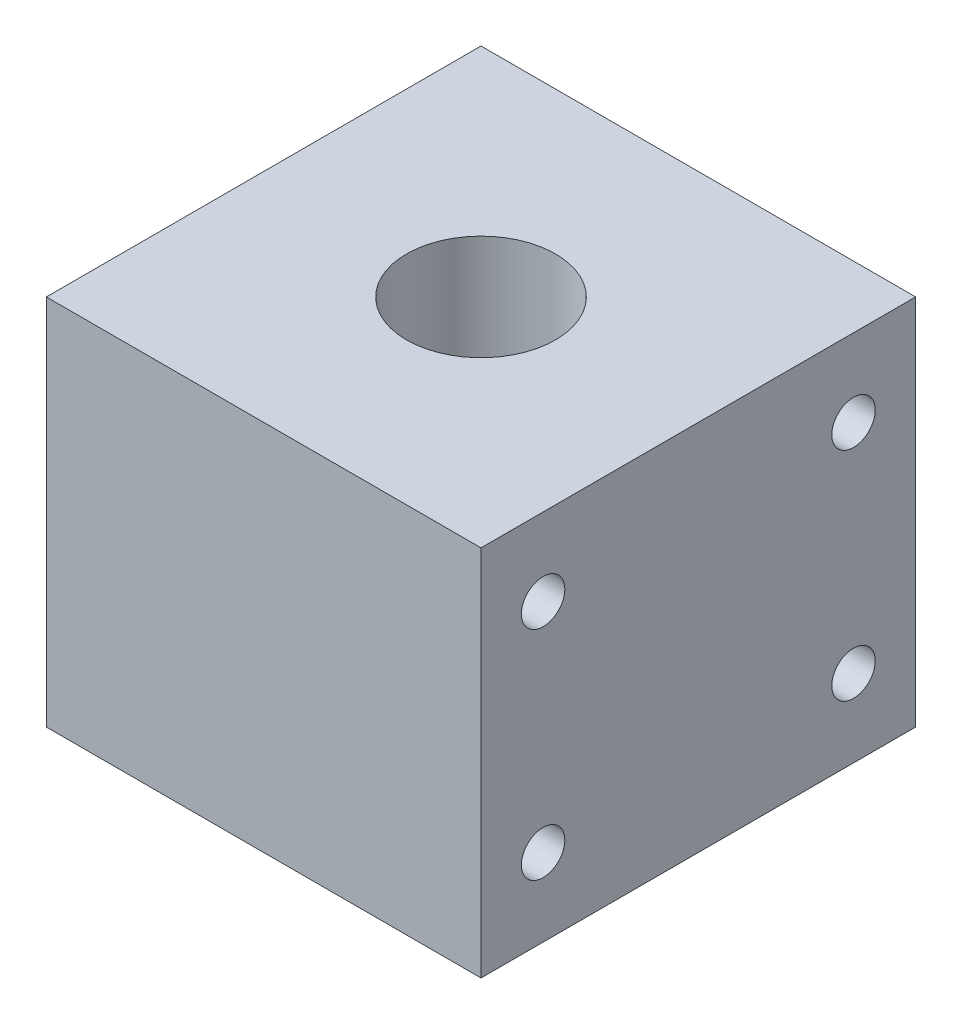
ISO-10303-21;
HEADER;
FILE_DESCRIPTION(('STEP AP214'),'2;1');
FILE_NAME('part.step','',(''),(''),'','','');
FILE_SCHEMA(('AUTOMOTIVE_DESIGN { 1 0 10303 214 1 1 1 1 }'));
ENDSEC;
DATA;
#1=APPLICATION_CONTEXT('core data for automotive mechanical design processes');
#2=APPLICATION_PROTOCOL_DEFINITION('international standard','automotive_design',2000,#1);
#3=PRODUCT_CONTEXT('',#1,'mechanical');
#4=PRODUCT('Part','Part','',(#3));
#5=PRODUCT_RELATED_PRODUCT_CATEGORY('part','',(#4));
#6=PRODUCT_DEFINITION_FORMATION('','',#4);
#7=PRODUCT_DEFINITION_CONTEXT('part definition',#1,'design');
#8=PRODUCT_DEFINITION('design','',#6,#7);
#9=PRODUCT_DEFINITION_SHAPE('','',#8);
#10=(LENGTH_UNIT() NAMED_UNIT(*) SI_UNIT(.MILLI.,.METRE.));
#11=(NAMED_UNIT(*) PLANE_ANGLE_UNIT() SI_UNIT($,.RADIAN.));
#12=(NAMED_UNIT(*) SI_UNIT($,.STERADIAN.) SOLID_ANGLE_UNIT());
#13=UNCERTAINTY_MEASURE_WITH_UNIT(LENGTH_MEASURE(1.E-05),#10,'distance_accuracy_value','');
#14=(GEOMETRIC_REPRESENTATION_CONTEXT(3) GLOBAL_UNCERTAINTY_ASSIGNED_CONTEXT((#13)) GLOBAL_UNIT_ASSIGNED_CONTEXT((#10,
#11,#12)) REPRESENTATION_CONTEXT('',''));
#15=CARTESIAN_POINT('',(0.,0.,0.));
#16=DIRECTION('',(0.,0.,1.));
#17=DIRECTION('',(1.,0.,0.));
#18=AXIS2_PLACEMENT_3D('',#15,#16,#17);
#19=CARTESIAN_POINT('',(0.,23.,0.));
#20=DIRECTION('',(0.,1.,0.));
#21=DIRECTION('',(0.,0.,1.));
#22=AXIS2_PLACEMENT_3D('',#19,#20,#21);
#23=PLANE('',#22);
#24=CARTESIAN_POINT('',(35.,23.,-35.));
#25=DIRECTION('',(0.,1.,0.));
#26=DIRECTION('',(0.,0.,1.));
#27=AXIS2_PLACEMENT_3D('',#24,#25,#26);
#28=CIRCLE('',#27,23.5);
#29=CARTESIAN_POINT('',(35.,23.,-11.5));
#30=VERTEX_POINT('',#29);
#31=EDGE_CURVE('E218',#30,#30,#28,.T.);
#32=ORIENTED_EDGE('',*,*,#31,.F.);
#33=EDGE_LOOP('',(#32));
#34=FACE_BOUND('',#33,.T.);
#35=CARTESIAN_POINT('',(35.,23.,-35.));
#36=DIRECTION('',(0.,1.,0.));
#37=DIRECTION('',(0.,0.,1.));
#38=AXIS2_PLACEMENT_3D('',#35,#36,#37);
#39=CIRCLE('',#38,16.);
#40=CARTESIAN_POINT('',(35.,23.,-19.));
#41=VERTEX_POINT('',#40);
#42=EDGE_CURVE('E217',#41,#41,#39,.F.);
#43=ORIENTED_EDGE('',*,*,#42,.F.);
#44=EDGE_LOOP('',(#43));
#45=FACE_BOUND('',#44,.T.);
#46=ADVANCED_FACE('F37',(#34,#45),#23,.F.);
#47=CARTESIAN_POINT('',(0.,0.,0.));
#48=DIRECTION('',(0.,1.,0.));
#49=DIRECTION('',(0.,0.,1.));
#50=AXIS2_PLACEMENT_3D('',#47,#48,#49);
#51=PLANE('',#50);
#52=DIRECTION('',(1.,0.,0.));
#53=VECTOR('',#52,1.);
#54=CARTESIAN_POINT('',(0.,0.,-65.));
#55=LINE('',#54,#53);
#56=CARTESIAN_POINT('',(15.0000000000001,0.,-65.));
#57=VERTEX_POINT('',#56);
#58=CARTESIAN_POINT('',(54.9999999999999,0.,-65.));
#59=VERTEX_POINT('',#58);
#60=EDGE_CURVE('E225',#57,#59,#55,.T.);
#61=ORIENTED_EDGE('',*,*,#60,.F.);
#62=CARTESIAN_POINT('',(15.,0.,-55.));
#63=DIRECTION('',(0.,1.,0.));
#64=DIRECTION('',(0.,0.,1.));
#65=AXIS2_PLACEMENT_3D('',#62,#63,#64);
#66=CIRCLE('',#65,10.);
#67=CARTESIAN_POINT('',(5.,0.,-54.9999999999999));
#68=VERTEX_POINT('',#67);
#69=EDGE_CURVE('E52',#68,#57,#66,.F.);
#70=ORIENTED_EDGE('',*,*,#69,.F.);
#71=DIRECTION('',(0.,0.,-1.));
#72=VECTOR('',#71,1.);
#73=CARTESIAN_POINT('',(5.00000000000001,0.,0.));
#74=LINE('',#73,#72);
#75=CARTESIAN_POINT('',(5.,0.,-15.0000000000001));
#76=VERTEX_POINT('',#75);
#77=EDGE_CURVE('E248',#76,#68,#74,.T.);
#78=ORIENTED_EDGE('',*,*,#77,.F.);
#79=CARTESIAN_POINT('',(15.,0.,-15.));
#80=DIRECTION('',(0.,1.,0.));
#81=DIRECTION('',(0.,0.,1.));
#82=AXIS2_PLACEMENT_3D('',#79,#80,#81);
#83=CIRCLE('',#82,10.);
#84=CARTESIAN_POINT('',(15.0000000000001,0.,-4.99999999999999));
#85=VERTEX_POINT('',#84);
#86=EDGE_CURVE('E251',#85,#76,#83,.F.);
#87=ORIENTED_EDGE('',*,*,#86,.F.);
#88=DIRECTION('',(-1.,0.,0.));
#89=VECTOR('',#88,1.);
#90=CARTESIAN_POINT('',(0.,0.,-4.99999999999999));
#91=LINE('',#90,#89);
#92=CARTESIAN_POINT('',(54.9999999999999,0.,-4.99999999999999));
#93=VERTEX_POINT('',#92);
#94=EDGE_CURVE('E254',#93,#85,#91,.T.);
#95=ORIENTED_EDGE('',*,*,#94,.F.);
#96=CARTESIAN_POINT('',(55.,0.,-15.));
#97=DIRECTION('',(0.,1.,0.));
#98=DIRECTION('',(0.,0.,1.));
#99=AXIS2_PLACEMENT_3D('',#96,#97,#98);
#100=CIRCLE('',#99,10.);
#101=CARTESIAN_POINT('',(65.,0.,-15.0000000000001));
#102=VERTEX_POINT('',#101);
#103=EDGE_CURVE('E257',#102,#93,#100,.F.);
#104=ORIENTED_EDGE('',*,*,#103,.F.);
#105=DIRECTION('',(0.,0.,1.));
#106=VECTOR('',#105,1.);
#107=CARTESIAN_POINT('',(65.,0.,0.));
#108=LINE('',#107,#106);
#109=CARTESIAN_POINT('',(65.,0.,-54.9999999999999));
#110=VERTEX_POINT('',#109);
#111=EDGE_CURVE('E260',#110,#102,#108,.T.);
#112=ORIENTED_EDGE('',*,*,#111,.F.);
#113=CARTESIAN_POINT('',(55.,0.,-55.));
#114=DIRECTION('',(0.,1.,0.));
#115=DIRECTION('',(0.,0.,1.));
#116=AXIS2_PLACEMENT_3D('',#113,#114,#115);
#117=CIRCLE('',#116,10.);
#118=EDGE_CURVE('E263',#59,#110,#117,.F.);
#119=ORIENTED_EDGE('',*,*,#118,.F.);
#120=EDGE_LOOP('',(#61,#70,#78,#87,#95,#104,#112,#119));
#121=FACE_BOUND('',#120,.T.);
#122=DIRECTION('',(1.,0.,0.));
#123=VECTOR('',#122,1.);
#124=CARTESIAN_POINT('',(0.,0.,0.));
#125=LINE('',#124,#123);
#126=CARTESIAN_POINT('',(0.,0.,0.));
#127=VERTEX_POINT('',#126);
#128=CARTESIAN_POINT('',(70.,0.,0.));
#129=VERTEX_POINT('',#128);
#130=EDGE_CURVE('E283',#127,#129,#125,.T.);
#131=ORIENTED_EDGE('',*,*,#130,.F.);
#132=DIRECTION('',(0.,0.,-1.));
#133=VECTOR('',#132,1.);
#134=CARTESIAN_POINT('',(0.,0.,0.));
#135=LINE('',#134,#133);
#136=CARTESIAN_POINT('',(0.,0.,-70.));
#137=VERTEX_POINT('',#136);
#138=EDGE_CURVE('E286',#127,#137,#135,.T.);
#139=ORIENTED_EDGE('',*,*,#138,.T.);
#140=DIRECTION('',(1.,0.,0.));
#141=VECTOR('',#140,1.);
#142=CARTESIAN_POINT('',(0.,0.,-70.));
#143=LINE('',#142,#141);
#144=CARTESIAN_POINT('',(70.,0.,-70.));
#145=VERTEX_POINT('',#144);
#146=EDGE_CURVE('E300',#137,#145,#143,.T.);
#147=ORIENTED_EDGE('',*,*,#146,.T.);
#148=DIRECTION('',(0.,0.,-1.));
#149=VECTOR('',#148,1.);
#150=CARTESIAN_POINT('',(70.,0.,0.));
#151=LINE('',#150,#149);
#152=EDGE_CURVE('E297',#129,#145,#151,.T.);
#153=ORIENTED_EDGE('',*,*,#152,.F.);
#154=EDGE_LOOP('',(#131,#139,#147,#153));
#155=FACE_BOUND('',#154,.T.);
#156=ADVANCED_FACE('F340',(#121,#155),#51,.F.);
#157=CARTESIAN_POINT('',(0.,60.,0.));
#158=DIRECTION('',(0.,0.,-1.));
#159=DIRECTION('',(-1.,0.,0.));
#160=AXIS2_PLACEMENT_3D('',#157,#158,#159);
#161=PLANE('',#160);
#162=ORIENTED_EDGE('',*,*,#130,.T.);
#163=DIRECTION('',(0.,-1.,0.));
#164=VECTOR('',#163,1.);
#165=CARTESIAN_POINT('',(70.,60.,0.));
#166=LINE('',#165,#164);
#167=CARTESIAN_POINT('',(70.,60.,0.));
#168=VERTEX_POINT('',#167);
#169=EDGE_CURVE('E310',#168,#129,#166,.T.);
#170=ORIENTED_EDGE('',*,*,#169,.F.);
#171=DIRECTION('',(1.,0.,0.));
#172=VECTOR('',#171,1.);
#173=CARTESIAN_POINT('',(0.,60.,0.));
#174=LINE('',#173,#172);
#175=CARTESIAN_POINT('',(0.,60.,0.));
#176=VERTEX_POINT('',#175);
#177=EDGE_CURVE('E284',#176,#168,#174,.T.);
#178=ORIENTED_EDGE('',*,*,#177,.F.);
#179=DIRECTION('',(0.,-1.,0.));
#180=VECTOR('',#179,1.);
#181=CARTESIAN_POINT('',(0.,60.,0.));
#182=LINE('',#181,#180);
#183=EDGE_CURVE('E61',#176,#127,#182,.T.);
#184=ORIENTED_EDGE('',*,*,#183,.T.);
#185=EDGE_LOOP('',(#162,#170,#178,#184));
#186=FACE_BOUND('',#185,.T.);
#187=ADVANCED_FACE('F346',(#186),#161,.F.);
#188=CARTESIAN_POINT('',(70.,60.,0.));
#189=DIRECTION('',(-1.,0.,0.));
#190=DIRECTION('',(0.,0.,1.));
#191=AXIS2_PLACEMENT_3D('',#188,#189,#190);
#192=PLANE('',#191);
#193=CARTESIAN_POINT('',(70.,47.5,-10.));
#194=DIRECTION('',(1.,0.,0.));
#195=DIRECTION('',(0.,0.,-1.));
#196=AXIS2_PLACEMENT_3D('',#193,#194,#195);
#197=CIRCLE('',#196,3.49999999999999);
#198=CARTESIAN_POINT('',(70.,47.5,-13.5));
#199=VERTEX_POINT('',#198);
#200=EDGE_CURVE('E190',#199,#199,#197,.T.);
#201=ORIENTED_EDGE('',*,*,#200,.F.);
#202=EDGE_LOOP('',(#201));
#203=FACE_BOUND('',#202,.T.);
#204=CARTESIAN_POINT('',(70.,47.5,-60.));
#205=DIRECTION('',(1.,0.,0.));
#206=DIRECTION('',(0.,0.,-1.));
#207=AXIS2_PLACEMENT_3D('',#204,#205,#206);
#208=CIRCLE('',#207,3.49999999999999);
#209=CARTESIAN_POINT('',(70.,47.5,-63.5));
#210=VERTEX_POINT('',#209);
#211=EDGE_CURVE('E196',#210,#210,#208,.T.);
#212=ORIENTED_EDGE('',*,*,#211,.F.);
#213=EDGE_LOOP('',(#212));
#214=FACE_BOUND('',#213,.T.);
#215=CARTESIAN_POINT('',(70.,12.5,-10.));
#216=DIRECTION('',(1.,0.,0.));
#217=DIRECTION('',(0.,0.,-1.));
#218=AXIS2_PLACEMENT_3D('',#215,#216,#217);
#219=CIRCLE('',#218,3.49999999999999);
#220=CARTESIAN_POINT('',(70.,12.5,-13.5));
#221=VERTEX_POINT('',#220);
#222=EDGE_CURVE('E202',#221,#221,#219,.T.);
#223=ORIENTED_EDGE('',*,*,#222,.F.);
#224=EDGE_LOOP('',(#223));
#225=FACE_BOUND('',#224,.T.);
#226=CARTESIAN_POINT('',(70.,12.5,-60.));
#227=DIRECTION('',(1.,0.,0.));
#228=DIRECTION('',(0.,0.,-1.));
#229=AXIS2_PLACEMENT_3D('',#226,#227,#228);
#230=CIRCLE('',#229,3.49999999999999);
#231=CARTESIAN_POINT('',(70.,12.5,-63.5));
#232=VERTEX_POINT('',#231);
#233=EDGE_CURVE('E208',#232,#232,#230,.T.);
#234=ORIENTED_EDGE('',*,*,#233,.F.);
#235=EDGE_LOOP('',(#234));
#236=FACE_BOUND('',#235,.T.);
#237=ORIENTED_EDGE('',*,*,#152,.T.);
#238=DIRECTION('',(0.,-1.,0.));
#239=VECTOR('',#238,1.);
#240=CARTESIAN_POINT('',(70.,60.,-70.));
#241=LINE('',#240,#239);
#242=CARTESIAN_POINT('',(70.,60.,-70.));
#243=VERTEX_POINT('',#242);
#244=EDGE_CURVE('E308',#243,#145,#241,.T.);
#245=ORIENTED_EDGE('',*,*,#244,.F.);
#246=DIRECTION('',(0.,0.,-1.));
#247=VECTOR('',#246,1.);
#248=CARTESIAN_POINT('',(70.,60.,0.));
#249=LINE('',#248,#247);
#250=EDGE_CURVE('E88',#168,#243,#249,.T.);
#251=ORIENTED_EDGE('',*,*,#250,.F.);
#252=ORIENTED_EDGE('',*,*,#169,.T.);
#253=EDGE_LOOP('',(#237,#245,#251,#252));
#254=FACE_BOUND('',#253,.T.);
#255=ADVANCED_FACE('F407',(#203,#214,#225,#236,#254),#192,.F.);
#256=CARTESIAN_POINT('',(0.,60.,-70.));
#257=DIRECTION('',(0.,0.,-1.));
#258=DIRECTION('',(-1.,0.,0.));
#259=AXIS2_PLACEMENT_3D('',#256,#257,#258);
#260=PLANE('',#259);
#261=ORIENTED_EDGE('',*,*,#146,.F.);
#262=DIRECTION('',(0.,-1.,0.));
#263=VECTOR('',#262,1.);
#264=CARTESIAN_POINT('',(0.,60.,-70.));
#265=LINE('',#264,#263);
#266=CARTESIAN_POINT('',(0.,60.,-70.));
#267=VERTEX_POINT('',#266);
#268=EDGE_CURVE('E306',#267,#137,#265,.T.);
#269=ORIENTED_EDGE('',*,*,#268,.F.);
#270=DIRECTION('',(1.,0.,0.));
#271=VECTOR('',#270,1.);
#272=CARTESIAN_POINT('',(0.,60.,-70.));
#273=LINE('',#272,#271);
#274=EDGE_CURVE('E288',#267,#243,#273,.T.);
#275=ORIENTED_EDGE('',*,*,#274,.T.);
#276=ORIENTED_EDGE('',*,*,#244,.T.);
#277=EDGE_LOOP('',(#261,#269,#275,#276));
#278=FACE_BOUND('',#277,.T.);
#279=ADVANCED_FACE('F403',(#278),#260,.T.);
#280=CARTESIAN_POINT('',(0.,60.,0.));
#281=DIRECTION('',(-1.,0.,0.));
#282=DIRECTION('',(0.,0.,1.));
#283=AXIS2_PLACEMENT_3D('',#280,#281,#282);
#284=PLANE('',#283);
#285=CARTESIAN_POINT('',(0.,47.5,-10.));
#286=DIRECTION('',(-1.,0.,0.));
#287=DIRECTION('',(0.,0.,1.));
#288=AXIS2_PLACEMENT_3D('',#285,#286,#287);
#289=CIRCLE('',#288,3.49999999999999);
#290=CARTESIAN_POINT('',(0.,47.5,-6.50000000000001));
#291=VERTEX_POINT('',#290);
#292=EDGE_CURVE('E168',#291,#291,#289,.T.);
#293=ORIENTED_EDGE('',*,*,#292,.F.);
#294=EDGE_LOOP('',(#293));
#295=FACE_BOUND('',#294,.T.);
#296=CARTESIAN_POINT('',(0.,47.5,-60.));
#297=DIRECTION('',(-1.,0.,0.));
#298=DIRECTION('',(0.,0.,1.));
#299=AXIS2_PLACEMENT_3D('',#296,#297,#298);
#300=CIRCLE('',#299,3.49999999999999);
#301=CARTESIAN_POINT('',(0.,47.5,-56.5));
#302=VERTEX_POINT('',#301);
#303=EDGE_CURVE('E167',#302,#302,#300,.T.);
#304=ORIENTED_EDGE('',*,*,#303,.F.);
#305=EDGE_LOOP('',(#304));
#306=FACE_BOUND('',#305,.T.);
#307=CARTESIAN_POINT('',(0.,12.5,-10.));
#308=DIRECTION('',(-1.,0.,0.));
#309=DIRECTION('',(0.,0.,1.));
#310=AXIS2_PLACEMENT_3D('',#307,#308,#309);
#311=CIRCLE('',#310,3.49999999999999);
#312=CARTESIAN_POINT('',(0.,12.5,-6.50000000000001));
#313=VERTEX_POINT('',#312);
#314=EDGE_CURVE('E178',#313,#313,#311,.T.);
#315=ORIENTED_EDGE('',*,*,#314,.F.);
#316=EDGE_LOOP('',(#315));
#317=FACE_BOUND('',#316,.T.);
#318=CARTESIAN_POINT('',(0.,12.5,-60.));
#319=DIRECTION('',(-1.,0.,0.));
#320=DIRECTION('',(0.,0.,1.));
#321=AXIS2_PLACEMENT_3D('',#318,#319,#320);
#322=CIRCLE('',#321,3.49999999999999);
#323=CARTESIAN_POINT('',(0.,12.5,-56.5));
#324=VERTEX_POINT('',#323);
#325=EDGE_CURVE('E184',#324,#324,#322,.T.);
#326=ORIENTED_EDGE('',*,*,#325,.F.);
#327=EDGE_LOOP('',(#326));
#328=FACE_BOUND('',#327,.T.);
#329=ORIENTED_EDGE('',*,*,#138,.F.);
#330=ORIENTED_EDGE('',*,*,#183,.F.);
#331=DIRECTION('',(0.,0.,-1.));
#332=VECTOR('',#331,1.);
#333=CARTESIAN_POINT('',(0.,60.,0.));
#334=LINE('',#333,#332);
#335=EDGE_CURVE('E291',#176,#267,#334,.T.);
#336=ORIENTED_EDGE('',*,*,#335,.T.);
#337=ORIENTED_EDGE('',*,*,#268,.T.);
#338=EDGE_LOOP('',(#329,#330,#336,#337));
#339=FACE_BOUND('',#338,.T.);
#340=ADVANCED_FACE('F399',(#295,#306,#317,#328,#339),#284,.T.);
#341=CARTESIAN_POINT('',(35.,60.,-35.));
#342=DIRECTION('',(0.,-1.,0.));
#343=DIRECTION('',(0.,0.,-1.));
#344=AXIS2_PLACEMENT_3D('',#341,#342,#343);
#345=CYLINDRICAL_SURFACE('',#344,12.);
#346=CARTESIAN_POINT('',(35.,42.,-35.));
#347=DIRECTION('',(0.,1.,0.));
#348=DIRECTION('',(0.,0.,1.));
#349=AXIS2_PLACEMENT_3D('',#346,#347,#348);
#350=CIRCLE('',#349,12.);
#351=CARTESIAN_POINT('',(35.,42.,-23.));
#352=VERTEX_POINT('',#351);
#353=EDGE_CURVE('E317',#352,#352,#350,.F.);
#354=ORIENTED_EDGE('',*,*,#353,.T.);
#355=EDGE_LOOP('',(#354));
#356=FACE_BOUND('',#355,.T.);
#357=CARTESIAN_POINT('',(35.,60.,-35.));
#358=DIRECTION('',(0.,1.,0.));
#359=DIRECTION('',(0.,0.,1.));
#360=AXIS2_PLACEMENT_3D('',#357,#358,#359);
#361=CIRCLE('',#360,12.);
#362=CARTESIAN_POINT('',(35.,60.,-23.));
#363=VERTEX_POINT('',#362);
#364=EDGE_CURVE('E293',#363,#363,#361,.T.);
#365=ORIENTED_EDGE('',*,*,#364,.T.);
#366=EDGE_LOOP('',(#365));
#367=FACE_BOUND('',#366,.T.);
#368=ADVANCED_FACE('F394',(#356,#367),#345,.F.);
#369=CARTESIAN_POINT('',(0.,60.,0.));
#370=DIRECTION('',(0.,1.,0.));
#371=DIRECTION('',(0.,0.,1.));
#372=AXIS2_PLACEMENT_3D('',#369,#370,#371);
#373=PLANE('',#372);
#374=ORIENTED_EDGE('',*,*,#177,.T.);
#375=ORIENTED_EDGE('',*,*,#250,.T.);
#376=ORIENTED_EDGE('',*,*,#274,.F.);
#377=ORIENTED_EDGE('',*,*,#335,.F.);
#378=EDGE_LOOP('',(#374,#375,#376,#377));
#379=FACE_BOUND('',#378,.T.);
#380=ORIENTED_EDGE('',*,*,#364,.F.);
#381=EDGE_LOOP('',(#380));
#382=FACE_BOUND('',#381,.T.);
#383=ADVANCED_FACE('F392',(#379,#382),#373,.T.);
#384=CARTESIAN_POINT('',(15.,3.,-55.));
#385=DIRECTION('',(0.,-1.,0.));
#386=DIRECTION('',(0.,0.,-1.));
#387=AXIS2_PLACEMENT_3D('',#384,#385,#386);
#388=CYLINDRICAL_SURFACE('',#387,10.);
#389=ORIENTED_EDGE('',*,*,#69,.T.);
#390=DIRECTION('',(0.,-1.,0.));
#391=VECTOR('',#390,1.);
#392=CARTESIAN_POINT('',(15.0000000000001,3.,-65.));
#393=LINE('',#392,#391);
#394=CARTESIAN_POINT('',(15.0000000000001,3.,-65.));
#395=VERTEX_POINT('',#394);
#396=EDGE_CURVE('E246',#395,#57,#393,.T.);
#397=ORIENTED_EDGE('',*,*,#396,.F.);
#398=CARTESIAN_POINT('',(15.,3.,-55.));
#399=DIRECTION('',(0.,1.,0.));
#400=DIRECTION('',(0.,0.,1.));
#401=AXIS2_PLACEMENT_3D('',#398,#399,#400);
#402=CIRCLE('',#401,10.);
#403=CARTESIAN_POINT('',(5.,3.,-54.9999999999999));
#404=VERTEX_POINT('',#403);
#405=EDGE_CURVE('E221',#404,#395,#402,.F.);
#406=ORIENTED_EDGE('',*,*,#405,.F.);
#407=DIRECTION('',(0.,-1.,0.));
#408=VECTOR('',#407,1.);
#409=CARTESIAN_POINT('',(5.,3.,-54.9999999999999));
#410=LINE('',#409,#408);
#411=EDGE_CURVE('E281',#404,#68,#410,.T.);
#412=ORIENTED_EDGE('',*,*,#411,.T.);
#413=EDGE_LOOP('',(#389,#397,#406,#412));
#414=FACE_BOUND('',#413,.T.);
#415=ADVANCED_FACE('F388',(#414),#388,.F.);
#416=CARTESIAN_POINT('',(5.00000000000001,3.,0.));
#417=DIRECTION('',(-1.,0.,0.));
#418=DIRECTION('',(0.,0.,1.));
#419=AXIS2_PLACEMENT_3D('',#416,#417,#418);
#420=PLANE('',#419);
#421=ORIENTED_EDGE('',*,*,#77,.T.);
#422=ORIENTED_EDGE('',*,*,#411,.F.);
#423=DIRECTION('',(0.,0.,-1.));
#424=VECTOR('',#423,1.);
#425=CARTESIAN_POINT('',(5.00000000000001,3.,0.));
#426=LINE('',#425,#424);
#427=CARTESIAN_POINT('',(5.,3.,-15.0000000000001));
#428=VERTEX_POINT('',#427);
#429=EDGE_CURVE('E224',#428,#404,#426,.T.);
#430=ORIENTED_EDGE('',*,*,#429,.F.);
#431=DIRECTION('',(0.,-1.,0.));
#432=VECTOR('',#431,1.);
#433=CARTESIAN_POINT('',(5.,3.,-15.0000000000001));
#434=LINE('',#433,#432);
#435=EDGE_CURVE('E279',#428,#76,#434,.T.);
#436=ORIENTED_EDGE('',*,*,#435,.T.);
#437=EDGE_LOOP('',(#421,#422,#430,#436));
#438=FACE_BOUND('',#437,.T.);
#439=ADVANCED_FACE('F384',(#438),#420,.F.);
#440=CARTESIAN_POINT('',(15.,3.,-15.));
#441=DIRECTION('',(0.,-1.,0.));
#442=DIRECTION('',(0.,0.,-1.));
#443=AXIS2_PLACEMENT_3D('',#440,#441,#442);
#444=CYLINDRICAL_SURFACE('',#443,10.);
#445=ORIENTED_EDGE('',*,*,#86,.T.);
#446=ORIENTED_EDGE('',*,*,#435,.F.);
#447=CARTESIAN_POINT('',(15.,3.,-15.));
#448=DIRECTION('',(0.,1.,0.));
#449=DIRECTION('',(0.,0.,1.));
#450=AXIS2_PLACEMENT_3D('',#447,#448,#449);
#451=CIRCLE('',#450,10.);
#452=CARTESIAN_POINT('',(15.0000000000001,3.,-4.99999999999999));
#453=VERTEX_POINT('',#452);
#454=EDGE_CURVE('E228',#453,#428,#451,.F.);
#455=ORIENTED_EDGE('',*,*,#454,.F.);
#456=DIRECTION('',(0.,-1.,0.));
#457=VECTOR('',#456,1.);
#458=CARTESIAN_POINT('',(15.0000000000001,3.,-4.99999999999999));
#459=LINE('',#458,#457);
#460=EDGE_CURVE('E277',#453,#85,#459,.T.);
#461=ORIENTED_EDGE('',*,*,#460,.T.);
#462=EDGE_LOOP('',(#445,#446,#455,#461));
#463=FACE_BOUND('',#462,.T.);
#464=ADVANCED_FACE('F380',(#463),#444,.F.);
#465=CARTESIAN_POINT('',(0.,3.,-4.99999999999999));
#466=DIRECTION('',(0.,0.,1.));
#467=DIRECTION('',(1.,0.,0.));
#468=AXIS2_PLACEMENT_3D('',#465,#466,#467);
#469=PLANE('',#468);
#470=ORIENTED_EDGE('',*,*,#94,.T.);
#471=ORIENTED_EDGE('',*,*,#460,.F.);
#472=DIRECTION('',(-1.,0.,0.));
#473=VECTOR('',#472,1.);
#474=CARTESIAN_POINT('',(0.,3.,-4.99999999999999));
#475=LINE('',#474,#473);
#476=CARTESIAN_POINT('',(54.9999999999999,3.,-4.99999999999999));
#477=VERTEX_POINT('',#476);
#478=EDGE_CURVE('E231',#477,#453,#475,.T.);
#479=ORIENTED_EDGE('',*,*,#478,.F.);
#480=DIRECTION('',(0.,-1.,0.));
#481=VECTOR('',#480,1.);
#482=CARTESIAN_POINT('',(54.9999999999999,3.,-4.99999999999999));
#483=LINE('',#482,#481);
#484=EDGE_CURVE('E275',#477,#93,#483,.T.);
#485=ORIENTED_EDGE('',*,*,#484,.T.);
#486=EDGE_LOOP('',(#470,#471,#479,#485));
#487=FACE_BOUND('',#486,.T.);
#488=ADVANCED_FACE('F376',(#487),#469,.F.);
#489=CARTESIAN_POINT('',(55.,3.,-15.));
#490=DIRECTION('',(0.,-1.,0.));
#491=DIRECTION('',(0.,0.,-1.));
#492=AXIS2_PLACEMENT_3D('',#489,#490,#491);
#493=CYLINDRICAL_SURFACE('',#492,10.);
#494=ORIENTED_EDGE('',*,*,#103,.T.);
#495=ORIENTED_EDGE('',*,*,#484,.F.);
#496=CARTESIAN_POINT('',(55.,3.,-15.));
#497=DIRECTION('',(0.,1.,0.));
#498=DIRECTION('',(0.,0.,1.));
#499=AXIS2_PLACEMENT_3D('',#496,#497,#498);
#500=CIRCLE('',#499,10.);
#501=CARTESIAN_POINT('',(65.,3.,-15.0000000000001));
#502=VERTEX_POINT('',#501);
#503=EDGE_CURVE('E234',#502,#477,#500,.F.);
#504=ORIENTED_EDGE('',*,*,#503,.F.);
#505=DIRECTION('',(0.,-1.,0.));
#506=VECTOR('',#505,1.);
#507=CARTESIAN_POINT('',(65.,3.,-15.0000000000001));
#508=LINE('',#507,#506);
#509=EDGE_CURVE('E273',#502,#102,#508,.T.);
#510=ORIENTED_EDGE('',*,*,#509,.T.);
#511=EDGE_LOOP('',(#494,#495,#504,#510));
#512=FACE_BOUND('',#511,.T.);
#513=ADVANCED_FACE('F372',(#512),#493,.F.);
#514=CARTESIAN_POINT('',(65.,3.,0.));
#515=DIRECTION('',(1.,0.,0.));
#516=DIRECTION('',(0.,0.,-1.));
#517=AXIS2_PLACEMENT_3D('',#514,#515,#516);
#518=PLANE('',#517);
#519=ORIENTED_EDGE('',*,*,#111,.T.);
#520=ORIENTED_EDGE('',*,*,#509,.F.);
#521=DIRECTION('',(0.,0.,1.));
#522=VECTOR('',#521,1.);
#523=CARTESIAN_POINT('',(65.,3.,0.));
#524=LINE('',#523,#522);
#525=CARTESIAN_POINT('',(65.,3.,-54.9999999999999));
#526=VERTEX_POINT('',#525);
#527=EDGE_CURVE('E237',#526,#502,#524,.T.);
#528=ORIENTED_EDGE('',*,*,#527,.F.);
#529=DIRECTION('',(0.,-1.,0.));
#530=VECTOR('',#529,1.);
#531=CARTESIAN_POINT('',(65.,3.,-54.9999999999999));
#532=LINE('',#531,#530);
#533=EDGE_CURVE('E271',#526,#110,#532,.T.);
#534=ORIENTED_EDGE('',*,*,#533,.T.);
#535=EDGE_LOOP('',(#519,#520,#528,#534));
#536=FACE_BOUND('',#535,.T.);
#537=ADVANCED_FACE('F368',(#536),#518,.F.);
#538=CARTESIAN_POINT('',(55.,3.,-55.));
#539=DIRECTION('',(0.,-1.,0.));
#540=DIRECTION('',(0.,0.,-1.));
#541=AXIS2_PLACEMENT_3D('',#538,#539,#540);
#542=CYLINDRICAL_SURFACE('',#541,10.);
#543=ORIENTED_EDGE('',*,*,#118,.T.);
#544=ORIENTED_EDGE('',*,*,#533,.F.);
#545=CARTESIAN_POINT('',(55.,3.,-55.));
#546=DIRECTION('',(0.,1.,0.));
#547=DIRECTION('',(0.,0.,1.));
#548=AXIS2_PLACEMENT_3D('',#545,#546,#547);
#549=CIRCLE('',#548,10.);
#550=CARTESIAN_POINT('',(54.9999999999999,3.,-65.));
#551=VERTEX_POINT('',#550);
#552=EDGE_CURVE('E240',#551,#526,#549,.F.);
#553=ORIENTED_EDGE('',*,*,#552,.F.);
#554=DIRECTION('',(0.,-1.,0.));
#555=VECTOR('',#554,1.);
#556=CARTESIAN_POINT('',(54.9999999999999,3.,-65.));
#557=LINE('',#556,#555);
#558=EDGE_CURVE('E269',#551,#59,#557,.T.);
#559=ORIENTED_EDGE('',*,*,#558,.T.);
#560=EDGE_LOOP('',(#543,#544,#553,#559));
#561=FACE_BOUND('',#560,.T.);
#562=ADVANCED_FACE('F364',(#561),#542,.F.);
#563=CARTESIAN_POINT('',(0.,3.,-65.));
#564=DIRECTION('',(0.,0.,-1.));
#565=DIRECTION('',(-1.,0.,0.));
#566=AXIS2_PLACEMENT_3D('',#563,#564,#565);
#567=PLANE('',#566);
#568=ORIENTED_EDGE('',*,*,#60,.T.);
#569=ORIENTED_EDGE('',*,*,#558,.F.);
#570=DIRECTION('',(1.,0.,0.));
#571=VECTOR('',#570,1.);
#572=CARTESIAN_POINT('',(0.,3.,-65.));
#573=LINE('',#572,#571);
#574=EDGE_CURVE('E243',#395,#551,#573,.T.);
#575=ORIENTED_EDGE('',*,*,#574,.F.);
#576=ORIENTED_EDGE('',*,*,#396,.T.);
#577=EDGE_LOOP('',(#568,#569,#575,#576));
#578=FACE_BOUND('',#577,.T.);
#579=ADVANCED_FACE('F360',(#578),#567,.F.);
#580=CARTESIAN_POINT('',(0.,3.,0.));
#581=DIRECTION('',(0.,1.,0.));
#582=DIRECTION('',(0.,0.,1.));
#583=AXIS2_PLACEMENT_3D('',#580,#581,#582);
#584=PLANE('',#583);
#585=CARTESIAN_POINT('',(35.,3.,-35.));
#586=DIRECTION('',(0.,1.,0.));
#587=DIRECTION('',(0.,0.,1.));
#588=AXIS2_PLACEMENT_3D('',#585,#586,#587);
#589=CIRCLE('',#588,25.5);
#590=CARTESIAN_POINT('',(35.,3.,-9.49999999999995));
#591=VERTEX_POINT('',#590);
#592=EDGE_CURVE('E11',#591,#591,#589,.T.);
#593=ORIENTED_EDGE('',*,*,#592,.T.);
#594=EDGE_LOOP('',(#593));
#595=FACE_BOUND('',#594,.T.);
#596=ORIENTED_EDGE('',*,*,#405,.T.);
#597=ORIENTED_EDGE('',*,*,#574,.T.);
#598=ORIENTED_EDGE('',*,*,#552,.T.);
#599=ORIENTED_EDGE('',*,*,#527,.T.);
#600=ORIENTED_EDGE('',*,*,#503,.T.);
#601=ORIENTED_EDGE('',*,*,#478,.T.);
#602=ORIENTED_EDGE('',*,*,#454,.T.);
#603=ORIENTED_EDGE('',*,*,#429,.T.);
#604=EDGE_LOOP('',(#596,#597,#598,#599,#600,#601,#602,#603));
#605=FACE_BOUND('',#604,.T.);
#606=ADVANCED_FACE('F357',(#595,#605),#584,.F.);
#607=CARTESIAN_POINT('',(35.,23.,-35.));
#608=DIRECTION('',(0.,-1.,0.));
#609=DIRECTION('',(0.,0.,-1.));
#610=AXIS2_PLACEMENT_3D('',#607,#608,#609);
#611=CYLINDRICAL_SURFACE('',#610,23.5);
#612=CARTESIAN_POINT('',(35.,5.00000000000005,-35.));
#613=DIRECTION('',(0.,1.,0.));
#614=DIRECTION('',(0.,0.,1.));
#615=AXIS2_PLACEMENT_3D('',#612,#613,#614);
#616=CIRCLE('',#615,23.5);
#617=CARTESIAN_POINT('',(35.,5.00000000000005,-11.5));
#618=VERTEX_POINT('',#617);
#619=EDGE_CURVE('E45',#618,#618,#616,.F.);
#620=ORIENTED_EDGE('',*,*,#619,.T.);
#621=EDGE_LOOP('',(#620));
#622=FACE_BOUND('',#621,.T.);
#623=ORIENTED_EDGE('',*,*,#31,.T.);
#624=EDGE_LOOP('',(#623));
#625=FACE_BOUND('',#624,.T.);
#626=ADVANCED_FACE('F322',(#622,#625),#611,.F.);
#627=CARTESIAN_POINT('',(35.,40.,-35.));
#628=DIRECTION('',(0.,-1.,0.));
#629=DIRECTION('',(0.,0.,-1.));
#630=AXIS2_PLACEMENT_3D('',#627,#628,#629);
#631=CYLINDRICAL_SURFACE('',#630,16.);
#632=CARTESIAN_POINT('',(35.,40.,-35.));
#633=DIRECTION('',(0.,1.,0.));
#634=DIRECTION('',(0.,0.,1.));
#635=AXIS2_PLACEMENT_3D('',#632,#633,#634);
#636=CIRCLE('',#635,16.);
#637=CARTESIAN_POINT('',(35.,40.,-19.));
#638=VERTEX_POINT('',#637);
#639=EDGE_CURVE('E214',#638,#638,#636,.T.);
#640=ORIENTED_EDGE('',*,*,#639,.T.);
#641=EDGE_LOOP('',(#640));
#642=FACE_BOUND('',#641,.T.);
#643=ORIENTED_EDGE('',*,*,#42,.T.);
#644=EDGE_LOOP('',(#643));
#645=FACE_BOUND('',#644,.T.);
#646=ADVANCED_FACE('F353',(#642,#645),#631,.F.);
#647=CARTESIAN_POINT('',(0.,40.,0.));
#648=DIRECTION('',(0.,1.,0.));
#649=DIRECTION('',(0.,0.,1.));
#650=AXIS2_PLACEMENT_3D('',#647,#648,#649);
#651=PLANE('',#650);
#652=CARTESIAN_POINT('',(35.,40.,-35.));
#653=DIRECTION('',(0.,1.,0.));
#654=DIRECTION('',(0.,0.,1.));
#655=AXIS2_PLACEMENT_3D('',#652,#653,#654);
#656=CIRCLE('',#655,14.);
#657=CARTESIAN_POINT('',(35.,40.,-21.));
#658=VERTEX_POINT('',#657);
#659=EDGE_CURVE('E312',#658,#658,#656,.T.);
#660=ORIENTED_EDGE('',*,*,#659,.T.);
#661=EDGE_LOOP('',(#660));
#662=FACE_BOUND('',#661,.T.);
#663=ORIENTED_EDGE('',*,*,#639,.F.);
#664=EDGE_LOOP('',(#663));
#665=FACE_BOUND('',#664,.T.);
#666=ADVANCED_FACE('F336',(#662,#665),#651,.F.);
#667=CARTESIAN_POINT('',(35.,40.,-35.));
#668=DIRECTION('',(0.,-1.,0.));
#669=DIRECTION('',(0.,0.,-1.));
#670=AXIS2_PLACEMENT_3D('',#667,#668,#669);
#671=CONICAL_SURFACE('',#670,14.,0.785398163397448);
#672=ORIENTED_EDGE('',*,*,#353,.F.);
#673=EDGE_LOOP('',(#672));
#674=FACE_BOUND('',#673,.T.);
#675=ORIENTED_EDGE('',*,*,#659,.F.);
#676=EDGE_LOOP('',(#675));
#677=FACE_BOUND('',#676,.T.);
#678=ADVANCED_FACE('F327',(#674,#677),#671,.F.);
#679=CARTESIAN_POINT('',(35.,5.00000000000005,-35.));
#680=DIRECTION('',(0.,-1.,0.));
#681=DIRECTION('',(0.,0.,-1.));
#682=AXIS2_PLACEMENT_3D('',#679,#680,#681);
#683=CONICAL_SURFACE('',#682,23.5,0.785398163397448);
#684=ORIENTED_EDGE('',*,*,#592,.F.);
#685=EDGE_LOOP('',(#684));
#686=FACE_BOUND('',#685,.T.);
#687=ORIENTED_EDGE('',*,*,#619,.F.);
#688=EDGE_LOOP('',(#687));
#689=FACE_BOUND('',#688,.T.);
#690=ADVANCED_FACE('F39',(#686,#689),#683,.F.);
#691=CARTESIAN_POINT('',(62.,12.5,-60.));
#692=DIRECTION('',(1.,0.,0.));
#693=DIRECTION('',(0.,0.,-1.));
#694=AXIS2_PLACEMENT_3D('',#691,#692,#693);
#695=CONICAL_SURFACE('',#694,3.5,1.02974425867665);
#696=CARTESIAN_POINT('',(59.8969878334035,12.5,-60.));
#697=VERTEX_POINT('',#696);
#698=VERTEX_LOOP('',#697);
#699=FACE_BOUND('',#698,.T.);
#700=CARTESIAN_POINT('',(62.,12.5,-60.));
#701=DIRECTION('',(1.,0.,0.));
#702=DIRECTION('',(0.,0.,-1.));
#703=AXIS2_PLACEMENT_3D('',#700,#701,#702);
#704=CIRCLE('',#703,3.5);
#705=CARTESIAN_POINT('',(62.,12.5,-63.5));
#706=VERTEX_POINT('',#705);
#707=EDGE_CURVE('E211',#706,#706,#704,.T.);
#708=ORIENTED_EDGE('',*,*,#707,.T.);
#709=EDGE_LOOP('',(#708));
#710=FACE_BOUND('',#709,.T.);
#711=ADVANCED_FACE('F326',(#699,#710),#695,.F.);
#712=CARTESIAN_POINT('',(70.,12.5,-60.));
#713=DIRECTION('',(1.,0.,0.));
#714=DIRECTION('',(0.,0.,-1.));
#715=AXIS2_PLACEMENT_3D('',#712,#713,#714);
#716=CYLINDRICAL_SURFACE('',#715,3.49999999999999);
#717=ORIENTED_EDGE('',*,*,#707,.F.);
#718=EDGE_LOOP('',(#717));
#719=FACE_BOUND('',#718,.T.);
#720=ORIENTED_EDGE('',*,*,#233,.T.);
#721=EDGE_LOOP('',(#720));
#722=FACE_BOUND('',#721,.T.);
#723=ADVANCED_FACE('F333',(#719,#722),#716,.F.);
#724=CARTESIAN_POINT('',(62.,12.5,-10.));
#725=DIRECTION('',(1.,0.,0.));
#726=DIRECTION('',(0.,0.,-1.));
#727=AXIS2_PLACEMENT_3D('',#724,#725,#726);
#728=CONICAL_SURFACE('',#727,3.5,1.02974425867665);
#729=CARTESIAN_POINT('',(59.8969878334035,12.5,-10.));
#730=VERTEX_POINT('',#729);
#731=VERTEX_LOOP('',#730);
#732=FACE_BOUND('',#731,.T.);
#733=CARTESIAN_POINT('',(62.,12.5,-10.));
#734=DIRECTION('',(1.,0.,0.));
#735=DIRECTION('',(0.,0.,-1.));
#736=AXIS2_PLACEMENT_3D('',#733,#734,#735);
#737=CIRCLE('',#736,3.5);
#738=CARTESIAN_POINT('',(62.,12.5,-13.5));
#739=VERTEX_POINT('',#738);
#740=EDGE_CURVE('E205',#739,#739,#737,.T.);
#741=ORIENTED_EDGE('',*,*,#740,.T.);
#742=EDGE_LOOP('',(#741));
#743=FACE_BOUND('',#742,.T.);
#744=ADVANCED_FACE('F528',(#732,#743),#728,.F.);
#745=CARTESIAN_POINT('',(70.,12.5,-10.));
#746=DIRECTION('',(1.,0.,0.));
#747=DIRECTION('',(0.,0.,-1.));
#748=AXIS2_PLACEMENT_3D('',#745,#746,#747);
#749=CYLINDRICAL_SURFACE('',#748,3.49999999999999);
#750=ORIENTED_EDGE('',*,*,#740,.F.);
#751=EDGE_LOOP('',(#750));
#752=FACE_BOUND('',#751,.T.);
#753=ORIENTED_EDGE('',*,*,#222,.T.);
#754=EDGE_LOOP('',(#753));
#755=FACE_BOUND('',#754,.T.);
#756=ADVANCED_FACE('F538',(#752,#755),#749,.F.);
#757=CARTESIAN_POINT('',(62.,47.5,-60.));
#758=DIRECTION('',(1.,0.,0.));
#759=DIRECTION('',(0.,0.,-1.));
#760=AXIS2_PLACEMENT_3D('',#757,#758,#759);
#761=CONICAL_SURFACE('',#760,3.5,1.02974425867665);
#762=CARTESIAN_POINT('',(59.8969878334035,47.5,-60.));
#763=VERTEX_POINT('',#762);
#764=VERTEX_LOOP('',#763);
#765=FACE_BOUND('',#764,.T.);
#766=CARTESIAN_POINT('',(62.,47.5,-60.));
#767=DIRECTION('',(1.,0.,0.));
#768=DIRECTION('',(0.,0.,-1.));
#769=AXIS2_PLACEMENT_3D('',#766,#767,#768);
#770=CIRCLE('',#769,3.5);
#771=CARTESIAN_POINT('',(62.,47.5,-63.5));
#772=VERTEX_POINT('',#771);
#773=EDGE_CURVE('E199',#772,#772,#770,.T.);
#774=ORIENTED_EDGE('',*,*,#773,.T.);
#775=EDGE_LOOP('',(#774));
#776=FACE_BOUND('',#775,.T.);
#777=ADVANCED_FACE('F547',(#765,#776),#761,.F.);
#778=CARTESIAN_POINT('',(70.,47.5,-60.));
#779=DIRECTION('',(1.,0.,0.));
#780=DIRECTION('',(0.,0.,-1.));
#781=AXIS2_PLACEMENT_3D('',#778,#779,#780);
#782=CYLINDRICAL_SURFACE('',#781,3.49999999999999);
#783=ORIENTED_EDGE('',*,*,#773,.F.);
#784=EDGE_LOOP('',(#783));
#785=FACE_BOUND('',#784,.T.);
#786=ORIENTED_EDGE('',*,*,#211,.T.);
#787=EDGE_LOOP('',(#786));
#788=FACE_BOUND('',#787,.T.);
#789=ADVANCED_FACE('F557',(#785,#788),#782,.F.);
#790=CARTESIAN_POINT('',(62.,47.5,-10.));
#791=DIRECTION('',(1.,0.,0.));
#792=DIRECTION('',(0.,0.,-1.));
#793=AXIS2_PLACEMENT_3D('',#790,#791,#792);
#794=CONICAL_SURFACE('',#793,3.5,1.02974425867665);
#795=CARTESIAN_POINT('',(59.8969878334035,47.5,-10.));
#796=VERTEX_POINT('',#795);
#797=VERTEX_LOOP('',#796);
#798=FACE_BOUND('',#797,.T.);
#799=CARTESIAN_POINT('',(62.,47.5,-10.));
#800=DIRECTION('',(1.,0.,0.));
#801=DIRECTION('',(0.,0.,-1.));
#802=AXIS2_PLACEMENT_3D('',#799,#800,#801);
#803=CIRCLE('',#802,3.5);
#804=CARTESIAN_POINT('',(62.,47.5,-13.5));
#805=VERTEX_POINT('',#804);
#806=EDGE_CURVE('E193',#805,#805,#803,.T.);
#807=ORIENTED_EDGE('',*,*,#806,.T.);
#808=EDGE_LOOP('',(#807));
#809=FACE_BOUND('',#808,.T.);
#810=ADVANCED_FACE('F566',(#798,#809),#794,.F.);
#811=CARTESIAN_POINT('',(70.,47.5,-10.));
#812=DIRECTION('',(1.,0.,0.));
#813=DIRECTION('',(0.,0.,-1.));
#814=AXIS2_PLACEMENT_3D('',#811,#812,#813);
#815=CYLINDRICAL_SURFACE('',#814,3.49999999999999);
#816=ORIENTED_EDGE('',*,*,#806,.F.);
#817=EDGE_LOOP('',(#816));
#818=FACE_BOUND('',#817,.T.);
#819=ORIENTED_EDGE('',*,*,#200,.T.);
#820=EDGE_LOOP('',(#819));
#821=FACE_BOUND('',#820,.T.);
#822=ADVANCED_FACE('F576',(#818,#821),#815,.F.);
#823=CARTESIAN_POINT('',(8.,12.5,-60.));
#824=DIRECTION('',(-1.,0.,0.));
#825=DIRECTION('',(0.,0.,1.));
#826=AXIS2_PLACEMENT_3D('',#823,#824,#825);
#827=CONICAL_SURFACE('',#826,3.5,1.02974425867665);
#828=CARTESIAN_POINT('',(10.1030121665965,12.5,-60.));
#829=VERTEX_POINT('',#828);
#830=VERTEX_LOOP('',#829);
#831=FACE_BOUND('',#830,.T.);
#832=CARTESIAN_POINT('',(8.,12.5,-60.));
#833=DIRECTION('',(-1.,0.,0.));
#834=DIRECTION('',(0.,0.,1.));
#835=AXIS2_PLACEMENT_3D('',#832,#833,#834);
#836=CIRCLE('',#835,3.5);
#837=CARTESIAN_POINT('',(8.,12.5,-56.5));
#838=VERTEX_POINT('',#837);
#839=EDGE_CURVE('E187',#838,#838,#836,.T.);
#840=ORIENTED_EDGE('',*,*,#839,.T.);
#841=EDGE_LOOP('',(#840));
#842=FACE_BOUND('',#841,.T.);
#843=ADVANCED_FACE('F584',(#831,#842),#827,.F.);
#844=CARTESIAN_POINT('',(0.,12.5,-60.));
#845=DIRECTION('',(-1.,0.,0.));
#846=DIRECTION('',(0.,0.,1.));
#847=AXIS2_PLACEMENT_3D('',#844,#845,#846);
#848=CYLINDRICAL_SURFACE('',#847,3.49999999999999);
#849=ORIENTED_EDGE('',*,*,#839,.F.);
#850=EDGE_LOOP('',(#849));
#851=FACE_BOUND('',#850,.T.);
#852=ORIENTED_EDGE('',*,*,#325,.T.);
#853=EDGE_LOOP('',(#852));
#854=FACE_BOUND('',#853,.T.);
#855=ADVANCED_FACE('F593',(#851,#854),#848,.F.);
#856=CARTESIAN_POINT('',(8.,12.5,-10.));
#857=DIRECTION('',(-1.,0.,0.));
#858=DIRECTION('',(0.,0.,1.));
#859=AXIS2_PLACEMENT_3D('',#856,#857,#858);
#860=CONICAL_SURFACE('',#859,3.5,1.02974425867665);
#861=CARTESIAN_POINT('',(10.1030121665965,12.5,-10.));
#862=VERTEX_POINT('',#861);
#863=VERTEX_LOOP('',#862);
#864=FACE_BOUND('',#863,.T.);
#865=CARTESIAN_POINT('',(8.,12.5,-10.));
#866=DIRECTION('',(-1.,0.,0.));
#867=DIRECTION('',(0.,0.,1.));
#868=AXIS2_PLACEMENT_3D('',#865,#866,#867);
#869=CIRCLE('',#868,3.5);
#870=CARTESIAN_POINT('',(8.,12.5,-6.50000000000001));
#871=VERTEX_POINT('',#870);
#872=EDGE_CURVE('E181',#871,#871,#869,.T.);
#873=ORIENTED_EDGE('',*,*,#872,.T.);
#874=EDGE_LOOP('',(#873));
#875=FACE_BOUND('',#874,.T.);
#876=ADVANCED_FACE('F602',(#864,#875),#860,.F.);
#877=CARTESIAN_POINT('',(0.,12.5,-10.));
#878=DIRECTION('',(-1.,0.,0.));
#879=DIRECTION('',(0.,0.,1.));
#880=AXIS2_PLACEMENT_3D('',#877,#878,#879);
#881=CYLINDRICAL_SURFACE('',#880,3.49999999999999);
#882=ORIENTED_EDGE('',*,*,#872,.F.);
#883=EDGE_LOOP('',(#882));
#884=FACE_BOUND('',#883,.T.);
#885=ORIENTED_EDGE('',*,*,#314,.T.);
#886=EDGE_LOOP('',(#885));
#887=FACE_BOUND('',#886,.T.);
#888=ADVANCED_FACE('F612',(#884,#887),#881,.F.);
#889=CARTESIAN_POINT('',(8.,47.5,-60.));
#890=DIRECTION('',(-1.,0.,0.));
#891=DIRECTION('',(0.,0.,1.));
#892=AXIS2_PLACEMENT_3D('',#889,#890,#891);
#893=CONICAL_SURFACE('',#892,3.5,1.02974425867665);
#894=CARTESIAN_POINT('',(10.1030121665965,47.5,-60.));
#895=VERTEX_POINT('',#894);
#896=VERTEX_LOOP('',#895);
#897=FACE_BOUND('',#896,.T.);
#898=CARTESIAN_POINT('',(8.,47.5,-60.));
#899=DIRECTION('',(-1.,0.,0.));
#900=DIRECTION('',(0.,0.,1.));
#901=AXIS2_PLACEMENT_3D('',#898,#899,#900);
#902=CIRCLE('',#901,3.5);
#903=CARTESIAN_POINT('',(8.,47.5,-56.5));
#904=VERTEX_POINT('',#903);
#905=EDGE_CURVE('E171',#904,#904,#902,.T.);
#906=ORIENTED_EDGE('',*,*,#905,.T.);
#907=EDGE_LOOP('',(#906));
#908=FACE_BOUND('',#907,.T.);
#909=ADVANCED_FACE('F621',(#897,#908),#893,.F.);
#910=CARTESIAN_POINT('',(0.,47.5,-60.));
#911=DIRECTION('',(-1.,0.,0.));
#912=DIRECTION('',(0.,0.,1.));
#913=AXIS2_PLACEMENT_3D('',#910,#911,#912);
#914=CYLINDRICAL_SURFACE('',#913,3.49999999999999);
#915=ORIENTED_EDGE('',*,*,#905,.F.);
#916=EDGE_LOOP('',(#915));
#917=FACE_BOUND('',#916,.T.);
#918=ORIENTED_EDGE('',*,*,#303,.T.);
#919=EDGE_LOOP('',(#918));
#920=FACE_BOUND('',#919,.T.);
#921=ADVANCED_FACE('F161',(#917,#920),#914,.F.);
#922=CARTESIAN_POINT('',(8.,47.5,-10.));
#923=DIRECTION('',(-1.,0.,0.));
#924=DIRECTION('',(0.,0.,1.));
#925=AXIS2_PLACEMENT_3D('',#922,#923,#924);
#926=CONICAL_SURFACE('',#925,3.5,1.02974425867665);
#927=CARTESIAN_POINT('',(10.1030121665965,47.5,-10.));
#928=VERTEX_POINT('',#927);
#929=VERTEX_LOOP('',#928);
#930=FACE_BOUND('',#929,.T.);
#931=CARTESIAN_POINT('',(8.,47.5,-10.));
#932=DIRECTION('',(-1.,0.,0.));
#933=DIRECTION('',(0.,0.,1.));
#934=AXIS2_PLACEMENT_3D('',#931,#932,#933);
#935=CIRCLE('',#934,3.5);
#936=CARTESIAN_POINT('',(8.,47.5,-6.5));
#937=VERTEX_POINT('',#936);
#938=EDGE_CURVE('E165',#937,#937,#935,.T.);
#939=ORIENTED_EDGE('',*,*,#938,.T.);
#940=EDGE_LOOP('',(#939));
#941=FACE_BOUND('',#940,.T.);
#942=ADVANCED_FACE('F157',(#930,#941),#926,.F.);
#943=CARTESIAN_POINT('',(0.,47.5,-10.));
#944=DIRECTION('',(-1.,0.,0.));
#945=DIRECTION('',(0.,0.,1.));
#946=AXIS2_PLACEMENT_3D('',#943,#944,#945);
#947=CYLINDRICAL_SURFACE('',#946,3.49999999999999);
#948=ORIENTED_EDGE('',*,*,#938,.F.);
#949=EDGE_LOOP('',(#948));
#950=FACE_BOUND('',#949,.T.);
#951=ORIENTED_EDGE('',*,*,#292,.T.);
#952=EDGE_LOOP('',(#951));
#953=FACE_BOUND('',#952,.T.);
#954=ADVANCED_FACE('F160',(#950,#953),#947,.F.);
#955=CLOSED_SHELL('',(#46,#156,#187,#255,#279,#340,#368,#383,#415,#439,#464,#488,#513,#537,#562,
#579,#606,#626,#646,#666,#678,#690,#711,#723,#744,#756,#777,#789,#810,#822,#843,#855,#876,#888,
#909,#921,#942,#954));
#956=MANIFOLD_SOLID_BREP('B2',#955);
#957=ADVANCED_BREP_SHAPE_REPRESENTATION('',(#18,#956),#14);
#958=SHAPE_DEFINITION_REPRESENTATION(#9,#957);
ENDSEC;
END-ISO-10303-21;
